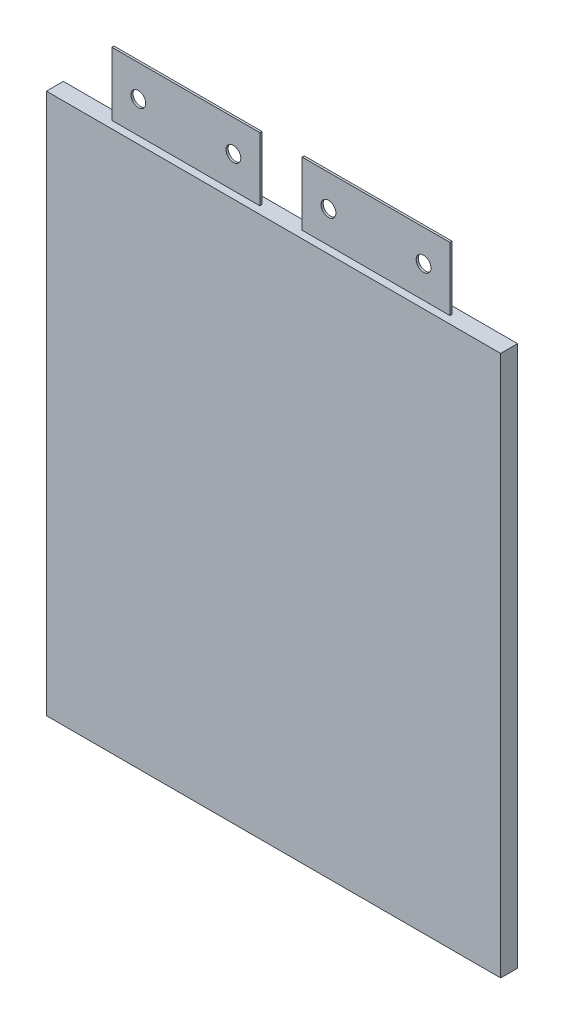
ISO-10303-21;
HEADER;
FILE_DESCRIPTION(('STEP AP214'),'2;1');
FILE_NAME('part.step','',(''),(''),'','','');
FILE_SCHEMA(('AUTOMOTIVE_DESIGN { 1 0 10303 214 1 1 1 1 }'));
ENDSEC;
DATA;
#1=APPLICATION_CONTEXT('core data for automotive mechanical design processes');
#2=APPLICATION_PROTOCOL_DEFINITION('international standard','automotive_design',2000,#1);
#3=PRODUCT_CONTEXT('',#1,'mechanical');
#4=PRODUCT('Part','Part','',(#3));
#5=PRODUCT_RELATED_PRODUCT_CATEGORY('part','',(#4));
#6=PRODUCT_DEFINITION_FORMATION('','',#4);
#7=PRODUCT_DEFINITION_CONTEXT('part definition',#1,'design');
#8=PRODUCT_DEFINITION('design','',#6,#7);
#9=PRODUCT_DEFINITION_SHAPE('','',#8);
#10=(LENGTH_UNIT() NAMED_UNIT(*) SI_UNIT(.MILLI.,.METRE.));
#11=(NAMED_UNIT(*) PLANE_ANGLE_UNIT() SI_UNIT($,.RADIAN.));
#12=(NAMED_UNIT(*) SI_UNIT($,.STERADIAN.) SOLID_ANGLE_UNIT());
#13=UNCERTAINTY_MEASURE_WITH_UNIT(LENGTH_MEASURE(1.E-05),#10,'distance_accuracy_value','');
#14=(GEOMETRIC_REPRESENTATION_CONTEXT(3) GLOBAL_UNCERTAINTY_ASSIGNED_CONTEXT((#13)) GLOBAL_UNIT_ASSIGNED_CONTEXT((#10,
#11,#12)) REPRESENTATION_CONTEXT('',''));
#15=CARTESIAN_POINT('',(0.,0.,0.));
#16=DIRECTION('',(0.,0.,1.));
#17=DIRECTION('',(1.,0.,0.));
#18=AXIS2_PLACEMENT_3D('',#15,#16,#17);
#19=CARTESIAN_POINT('',(0.,256.,8.));
#20=DIRECTION('',(0.,-1.,0.));
#21=DIRECTION('',(0.,0.,-1.));
#22=AXIS2_PLACEMENT_3D('',#19,#20,#21);
#23=PLANE('',#22);
#24=DIRECTION('',(-1.,0.,0.));
#25=VECTOR('',#24,1.);
#26=CARTESIAN_POINT('',(187.5,256.,3.49999999999998));
#27=LINE('',#26,#25);
#28=CARTESIAN_POINT('',(187.5,256.,3.49999999999998));
#29=VERTEX_POINT('',#28);
#30=CARTESIAN_POINT('',(117.5,256.,3.5));
#31=VERTEX_POINT('',#30);
#32=EDGE_CURVE('E127',#29,#31,#27,.T.);
#33=ORIENTED_EDGE('',*,*,#32,.F.);
#34=DIRECTION('',(0.,0.,1.));
#35=VECTOR('',#34,1.);
#36=CARTESIAN_POINT('',(187.5,256.,3.49999999999998));
#37=LINE('',#36,#35);
#38=CARTESIAN_POINT('',(187.5,256.,4.50000000000002));
#39=VERTEX_POINT('',#38);
#40=EDGE_CURVE('E136',#29,#39,#37,.T.);
#41=ORIENTED_EDGE('',*,*,#40,.T.);
#42=DIRECTION('',(-1.,0.,0.));
#43=VECTOR('',#42,1.);
#44=CARTESIAN_POINT('',(187.5,256.,4.50000000000002));
#45=LINE('',#44,#43);
#46=CARTESIAN_POINT('',(117.5,256.,4.5));
#47=VERTEX_POINT('',#46);
#48=EDGE_CURVE('E143',#39,#47,#45,.T.);
#49=ORIENTED_EDGE('',*,*,#48,.T.);
#50=DIRECTION('',(0.,0.,1.));
#51=VECTOR('',#50,1.);
#52=CARTESIAN_POINT('',(117.5,256.,3.5));
#53=LINE('',#52,#51);
#54=EDGE_CURVE('E47',#31,#47,#53,.T.);
#55=ORIENTED_EDGE('',*,*,#54,.F.);
#56=EDGE_LOOP('',(#33,#41,#49,#55));
#57=FACE_BOUND('',#56,.T.);
#58=DIRECTION('',(-1.,0.,0.));
#59=VECTOR('',#58,1.);
#60=CARTESIAN_POINT('',(0.,256.,0.));
#61=LINE('',#60,#59);
#62=CARTESIAN_POINT('',(215.,256.,0.));
#63=VERTEX_POINT('',#62);
#64=CARTESIAN_POINT('',(0.,256.,0.));
#65=VERTEX_POINT('',#64);
#66=EDGE_CURVE('E192',#63,#65,#61,.T.);
#67=ORIENTED_EDGE('',*,*,#66,.T.);
#68=DIRECTION('',(0.,0.,-1.));
#69=VECTOR('',#68,1.);
#70=CARTESIAN_POINT('',(0.,256.,8.));
#71=LINE('',#70,#69);
#72=CARTESIAN_POINT('',(0.,256.,8.));
#73=VERTEX_POINT('',#72);
#74=EDGE_CURVE('E198',#73,#65,#71,.T.);
#75=ORIENTED_EDGE('',*,*,#74,.F.);
#76=DIRECTION('',(-1.,0.,0.));
#77=VECTOR('',#76,1.);
#78=CARTESIAN_POINT('',(0.,256.,8.));
#79=LINE('',#78,#77);
#80=CARTESIAN_POINT('',(215.,256.,8.));
#81=VERTEX_POINT('',#80);
#82=EDGE_CURVE('E196',#81,#73,#79,.T.);
#83=ORIENTED_EDGE('',*,*,#82,.F.);
#84=DIRECTION('',(0.,0.,-1.));
#85=VECTOR('',#84,1.);
#86=CARTESIAN_POINT('',(215.,256.,8.));
#87=LINE('',#86,#85);
#88=EDGE_CURVE('E208',#81,#63,#87,.T.);
#89=ORIENTED_EDGE('',*,*,#88,.T.);
#90=EDGE_LOOP('',(#67,#75,#83,#89));
#91=FACE_BOUND('',#90,.T.);
#92=DIRECTION('',(0.,0.,1.));
#93=VECTOR('',#92,1.);
#94=CARTESIAN_POINT('',(27.5,256.,3.5));
#95=LINE('',#94,#93);
#96=CARTESIAN_POINT('',(27.5,256.,3.5));
#97=VERTEX_POINT('',#96);
#98=CARTESIAN_POINT('',(27.5,256.,4.5));
#99=VERTEX_POINT('',#98);
#100=EDGE_CURVE('E142',#97,#99,#95,.T.);
#101=ORIENTED_EDGE('',*,*,#100,.F.);
#102=DIRECTION('',(1.,0.,0.));
#103=VECTOR('',#102,1.);
#104=CARTESIAN_POINT('',(27.5,256.,3.5));
#105=LINE('',#104,#103);
#106=CARTESIAN_POINT('',(97.5,256.,3.5));
#107=VERTEX_POINT('',#106);
#108=EDGE_CURVE('E163',#97,#107,#105,.T.);
#109=ORIENTED_EDGE('',*,*,#108,.T.);
#110=DIRECTION('',(0.,0.,1.));
#111=VECTOR('',#110,1.);
#112=CARTESIAN_POINT('',(97.5,256.,3.5));
#113=LINE('',#112,#111);
#114=CARTESIAN_POINT('',(97.5,256.,4.5));
#115=VERTEX_POINT('',#114);
#116=EDGE_CURVE('E55',#107,#115,#113,.T.);
#117=ORIENTED_EDGE('',*,*,#116,.T.);
#118=DIRECTION('',(1.,0.,0.));
#119=VECTOR('',#118,1.);
#120=CARTESIAN_POINT('',(27.5,256.,4.5));
#121=LINE('',#120,#119);
#122=EDGE_CURVE('E174',#99,#115,#121,.T.);
#123=ORIENTED_EDGE('',*,*,#122,.F.);
#124=EDGE_LOOP('',(#101,#109,#117,#123));
#125=FACE_BOUND('',#124,.T.);
#126=ADVANCED_FACE('F32',(#57,#91,#125),#23,.F.);
#127=CARTESIAN_POINT('',(0.,0.,8.));
#128=DIRECTION('',(1.,0.,0.));
#129=DIRECTION('',(0.,0.,-1.));
#130=AXIS2_PLACEMENT_3D('',#127,#128,#129);
#131=PLANE('',#130);
#132=DIRECTION('',(0.,-1.,0.));
#133=VECTOR('',#132,1.);
#134=CARTESIAN_POINT('',(0.,0.,0.));
#135=LINE('',#134,#133);
#136=CARTESIAN_POINT('',(0.,0.,0.));
#137=VERTEX_POINT('',#136);
#138=EDGE_CURVE('E187',#65,#137,#135,.T.);
#139=ORIENTED_EDGE('',*,*,#138,.T.);
#140=DIRECTION('',(0.,0.,-1.));
#141=VECTOR('',#140,1.);
#142=CARTESIAN_POINT('',(0.,0.,8.));
#143=LINE('',#142,#141);
#144=CARTESIAN_POINT('',(0.,0.,8.));
#145=VERTEX_POINT('',#144);
#146=EDGE_CURVE('E11',#145,#137,#143,.T.);
#147=ORIENTED_EDGE('',*,*,#146,.F.);
#148=DIRECTION('',(0.,-1.,0.));
#149=VECTOR('',#148,1.);
#150=CARTESIAN_POINT('',(0.,0.,8.));
#151=LINE('',#150,#149);
#152=EDGE_CURVE('E188',#73,#145,#151,.T.);
#153=ORIENTED_EDGE('',*,*,#152,.F.);
#154=ORIENTED_EDGE('',*,*,#74,.T.);
#155=EDGE_LOOP('',(#139,#147,#153,#154));
#156=FACE_BOUND('',#155,.T.);
#157=ADVANCED_FACE('F34',(#156),#131,.F.);
#158=CARTESIAN_POINT('',(0.,0.,8.));
#159=DIRECTION('',(0.,1.,0.));
#160=DIRECTION('',(0.,0.,1.));
#161=AXIS2_PLACEMENT_3D('',#158,#159,#160);
#162=PLANE('',#161);
#163=DIRECTION('',(1.,0.,0.));
#164=VECTOR('',#163,1.);
#165=CARTESIAN_POINT('',(0.,0.,0.));
#166=LINE('',#165,#164);
#167=CARTESIAN_POINT('',(215.,0.,0.));
#168=VERTEX_POINT('',#167);
#169=EDGE_CURVE('E201',#137,#168,#166,.T.);
#170=ORIENTED_EDGE('',*,*,#169,.T.);
#171=DIRECTION('',(0.,0.,-1.));
#172=VECTOR('',#171,1.);
#173=CARTESIAN_POINT('',(215.,0.,8.));
#174=LINE('',#173,#172);
#175=CARTESIAN_POINT('',(215.,0.,8.));
#176=VERTEX_POINT('',#175);
#177=EDGE_CURVE('E40',#176,#168,#174,.T.);
#178=ORIENTED_EDGE('',*,*,#177,.F.);
#179=DIRECTION('',(1.,0.,0.));
#180=VECTOR('',#179,1.);
#181=CARTESIAN_POINT('',(0.,0.,8.));
#182=LINE('',#181,#180);
#183=EDGE_CURVE('E191',#145,#176,#182,.T.);
#184=ORIENTED_EDGE('',*,*,#183,.F.);
#185=ORIENTED_EDGE('',*,*,#146,.T.);
#186=EDGE_LOOP('',(#170,#178,#184,#185));
#187=FACE_BOUND('',#186,.T.);
#188=ADVANCED_FACE('F230',(#187),#162,.F.);
#189=CARTESIAN_POINT('',(215.,0.,8.));
#190=DIRECTION('',(-1.,0.,0.));
#191=DIRECTION('',(0.,0.,1.));
#192=AXIS2_PLACEMENT_3D('',#189,#190,#191);
#193=PLANE('',#192);
#194=DIRECTION('',(0.,1.,0.));
#195=VECTOR('',#194,1.);
#196=CARTESIAN_POINT('',(215.,0.,0.));
#197=LINE('',#196,#195);
#198=EDGE_CURVE('E203',#168,#63,#197,.T.);
#199=ORIENTED_EDGE('',*,*,#198,.T.);
#200=ORIENTED_EDGE('',*,*,#88,.F.);
#201=DIRECTION('',(0.,1.,0.));
#202=VECTOR('',#201,1.);
#203=CARTESIAN_POINT('',(215.,0.,8.));
#204=LINE('',#203,#202);
#205=EDGE_CURVE('E194',#176,#81,#204,.T.);
#206=ORIENTED_EDGE('',*,*,#205,.F.);
#207=ORIENTED_EDGE('',*,*,#177,.T.);
#208=EDGE_LOOP('',(#199,#200,#206,#207));
#209=FACE_BOUND('',#208,.T.);
#210=ADVANCED_FACE('F215',(#209),#193,.F.);
#211=CARTESIAN_POINT('',(0.,0.,8.));
#212=DIRECTION('',(0.,0.,-1.));
#213=DIRECTION('',(-1.,0.,0.));
#214=AXIS2_PLACEMENT_3D('',#211,#212,#213);
#215=PLANE('',#214);
#216=ORIENTED_EDGE('',*,*,#152,.T.);
#217=ORIENTED_EDGE('',*,*,#183,.T.);
#218=ORIENTED_EDGE('',*,*,#205,.T.);
#219=ORIENTED_EDGE('',*,*,#82,.T.);
#220=EDGE_LOOP('',(#216,#217,#218,#219));
#221=FACE_BOUND('',#220,.T.);
#222=ADVANCED_FACE('F229',(#221),#215,.F.);
#223=CARTESIAN_POINT('',(0.,0.,0.));
#224=DIRECTION('',(0.,0.,-1.));
#225=DIRECTION('',(-1.,0.,0.));
#226=AXIS2_PLACEMENT_3D('',#223,#224,#225);
#227=PLANE('',#226);
#228=ORIENTED_EDGE('',*,*,#138,.F.);
#229=ORIENTED_EDGE('',*,*,#66,.F.);
#230=ORIENTED_EDGE('',*,*,#198,.F.);
#231=ORIENTED_EDGE('',*,*,#169,.F.);
#232=EDGE_LOOP('',(#228,#229,#230,#231));
#233=FACE_BOUND('',#232,.T.);
#234=ADVANCED_FACE('F221',(#233),#227,.T.);
#235=CARTESIAN_POINT('',(27.5,286.,3.5));
#236=DIRECTION('',(1.,0.,0.));
#237=DIRECTION('',(0.,0.,-1.));
#238=AXIS2_PLACEMENT_3D('',#235,#236,#237);
#239=PLANE('',#238);
#240=ORIENTED_EDGE('',*,*,#100,.T.);
#241=DIRECTION('',(0.,-1.,0.));
#242=VECTOR('',#241,1.);
#243=CARTESIAN_POINT('',(27.5,286.,4.5));
#244=LINE('',#243,#242);
#245=CARTESIAN_POINT('',(27.5,286.,4.5));
#246=VERTEX_POINT('',#245);
#247=EDGE_CURVE('E185',#246,#99,#244,.T.);
#248=ORIENTED_EDGE('',*,*,#247,.F.);
#249=DIRECTION('',(0.,0.,1.));
#250=VECTOR('',#249,1.);
#251=CARTESIAN_POINT('',(27.5,286.,3.5));
#252=LINE('',#251,#250);
#253=CARTESIAN_POINT('',(27.5,286.,3.5));
#254=VERTEX_POINT('',#253);
#255=EDGE_CURVE('E159',#254,#246,#252,.T.);
#256=ORIENTED_EDGE('',*,*,#255,.F.);
#257=DIRECTION('',(0.,-1.,0.));
#258=VECTOR('',#257,1.);
#259=CARTESIAN_POINT('',(27.5,286.,3.5));
#260=LINE('',#259,#258);
#261=EDGE_CURVE('E171',#254,#97,#260,.T.);
#262=ORIENTED_EDGE('',*,*,#261,.T.);
#263=EDGE_LOOP('',(#240,#248,#256,#262));
#264=FACE_BOUND('',#263,.T.);
#265=ADVANCED_FACE('F244',(#264),#239,.F.);
#266=CARTESIAN_POINT('',(27.5,286.,4.5));
#267=DIRECTION('',(0.,0.,-1.));
#268=DIRECTION('',(-1.,0.,0.));
#269=AXIS2_PLACEMENT_3D('',#266,#267,#268);
#270=PLANE('',#269);
#271=CARTESIAN_POINT('',(40.,271.,4.5));
#272=DIRECTION('',(0.,0.,1.));
#273=DIRECTION('',(1.,0.,0.));
#274=AXIS2_PLACEMENT_3D('',#271,#272,#273);
#275=CIRCLE('',#274,3.5);
#276=CARTESIAN_POINT('',(43.5,271.,4.5));
#277=VERTEX_POINT('',#276);
#278=EDGE_CURVE('E133',#277,#277,#275,.T.);
#279=ORIENTED_EDGE('',*,*,#278,.F.);
#280=EDGE_LOOP('',(#279));
#281=FACE_BOUND('',#280,.T.);
#282=CARTESIAN_POINT('',(85.,271.,4.5));
#283=DIRECTION('',(0.,0.,1.));
#284=DIRECTION('',(1.,0.,0.));
#285=AXIS2_PLACEMENT_3D('',#282,#283,#284);
#286=CIRCLE('',#285,3.50000000000001);
#287=CARTESIAN_POINT('',(88.5,271.,4.5));
#288=VERTEX_POINT('',#287);
#289=EDGE_CURVE('E307',#288,#288,#286,.T.);
#290=ORIENTED_EDGE('',*,*,#289,.F.);
#291=EDGE_LOOP('',(#290));
#292=FACE_BOUND('',#291,.T.);
#293=ORIENTED_EDGE('',*,*,#122,.T.);
#294=DIRECTION('',(0.,-1.,0.));
#295=VECTOR('',#294,1.);
#296=CARTESIAN_POINT('',(97.5,286.,4.5));
#297=LINE('',#296,#295);
#298=CARTESIAN_POINT('',(97.5,286.,4.5));
#299=VERTEX_POINT('',#298);
#300=EDGE_CURVE('E183',#299,#115,#297,.T.);
#301=ORIENTED_EDGE('',*,*,#300,.F.);
#302=DIRECTION('',(1.,0.,0.));
#303=VECTOR('',#302,1.);
#304=CARTESIAN_POINT('',(27.5,286.,4.5));
#305=LINE('',#304,#303);
#306=EDGE_CURVE('E162',#246,#299,#305,.T.);
#307=ORIENTED_EDGE('',*,*,#306,.F.);
#308=ORIENTED_EDGE('',*,*,#247,.T.);
#309=EDGE_LOOP('',(#293,#301,#307,#308));
#310=FACE_BOUND('',#309,.T.);
#311=ADVANCED_FACE('F249',(#281,#292,#310),#270,.F.);
#312=CARTESIAN_POINT('',(97.5,286.,3.5));
#313=DIRECTION('',(1.,0.,0.));
#314=DIRECTION('',(0.,0.,-1.));
#315=AXIS2_PLACEMENT_3D('',#312,#313,#314);
#316=PLANE('',#315);
#317=ORIENTED_EDGE('',*,*,#116,.F.);
#318=DIRECTION('',(0.,-1.,0.));
#319=VECTOR('',#318,1.);
#320=CARTESIAN_POINT('',(97.5,286.,3.5));
#321=LINE('',#320,#319);
#322=CARTESIAN_POINT('',(97.5,286.,3.5));
#323=VERTEX_POINT('',#322);
#324=EDGE_CURVE('E181',#323,#107,#321,.T.);
#325=ORIENTED_EDGE('',*,*,#324,.F.);
#326=DIRECTION('',(0.,0.,1.));
#327=VECTOR('',#326,1.);
#328=CARTESIAN_POINT('',(97.5,286.,3.5));
#329=LINE('',#328,#327);
#330=EDGE_CURVE('E165',#323,#299,#329,.T.);
#331=ORIENTED_EDGE('',*,*,#330,.T.);
#332=ORIENTED_EDGE('',*,*,#300,.T.);
#333=EDGE_LOOP('',(#317,#325,#331,#332));
#334=FACE_BOUND('',#333,.T.);
#335=ADVANCED_FACE('F253',(#334),#316,.T.);
#336=CARTESIAN_POINT('',(27.5,286.,3.5));
#337=DIRECTION('',(0.,0.,-1.));
#338=DIRECTION('',(-1.,0.,0.));
#339=AXIS2_PLACEMENT_3D('',#336,#337,#338);
#340=PLANE('',#339);
#341=CARTESIAN_POINT('',(40.,271.,3.5));
#342=DIRECTION('',(0.,0.,-1.));
#343=DIRECTION('',(-1.,0.,0.));
#344=AXIS2_PLACEMENT_3D('',#341,#342,#343);
#345=CIRCLE('',#344,3.5);
#346=CARTESIAN_POINT('',(36.5,271.,3.5));
#347=VERTEX_POINT('',#346);
#348=EDGE_CURVE('E317',#347,#347,#345,.F.);
#349=ORIENTED_EDGE('',*,*,#348,.T.);
#350=EDGE_LOOP('',(#349));
#351=FACE_BOUND('',#350,.T.);
#352=CARTESIAN_POINT('',(85.,271.,3.5));
#353=DIRECTION('',(0.,0.,-1.));
#354=DIRECTION('',(-1.,0.,0.));
#355=AXIS2_PLACEMENT_3D('',#352,#353,#354);
#356=CIRCLE('',#355,3.50000000000001);
#357=CARTESIAN_POINT('',(81.5,271.,3.5));
#358=VERTEX_POINT('',#357);
#359=EDGE_CURVE('E320',#358,#358,#356,.F.);
#360=ORIENTED_EDGE('',*,*,#359,.T.);
#361=EDGE_LOOP('',(#360));
#362=FACE_BOUND('',#361,.T.);
#363=ORIENTED_EDGE('',*,*,#108,.F.);
#364=ORIENTED_EDGE('',*,*,#261,.F.);
#365=DIRECTION('',(1.,0.,0.));
#366=VECTOR('',#365,1.);
#367=CARTESIAN_POINT('',(27.5,286.,3.5));
#368=LINE('',#367,#366);
#369=EDGE_CURVE('E168',#254,#323,#368,.T.);
#370=ORIENTED_EDGE('',*,*,#369,.T.);
#371=ORIENTED_EDGE('',*,*,#324,.T.);
#372=EDGE_LOOP('',(#363,#364,#370,#371));
#373=FACE_BOUND('',#372,.T.);
#374=ADVANCED_FACE('F257',(#351,#362,#373),#340,.T.);
#375=CARTESIAN_POINT('',(0.,286.,0.));
#376=DIRECTION('',(0.,1.,0.));
#377=DIRECTION('',(0.,0.,1.));
#378=AXIS2_PLACEMENT_3D('',#375,#376,#377);
#379=PLANE('',#378);
#380=ORIENTED_EDGE('',*,*,#255,.T.);
#381=ORIENTED_EDGE('',*,*,#306,.T.);
#382=ORIENTED_EDGE('',*,*,#330,.F.);
#383=ORIENTED_EDGE('',*,*,#369,.F.);
#384=EDGE_LOOP('',(#380,#381,#382,#383));
#385=FACE_BOUND('',#384,.T.);
#386=ADVANCED_FACE('F260',(#385),#379,.T.);
#387=CARTESIAN_POINT('',(187.5,286.,3.49999999999998));
#388=DIRECTION('',(1.,0.,0.));
#389=DIRECTION('',(0.,0.,-1.));
#390=AXIS2_PLACEMENT_3D('',#387,#388,#389);
#391=PLANE('',#390);
#392=ORIENTED_EDGE('',*,*,#40,.F.);
#393=DIRECTION('',(0.,-1.,0.));
#394=VECTOR('',#393,1.);
#395=CARTESIAN_POINT('',(187.5,286.,3.49999999999998));
#396=LINE('',#395,#394);
#397=CARTESIAN_POINT('',(187.5,286.,3.49999999999998));
#398=VERTEX_POINT('',#397);
#399=EDGE_CURVE('E122',#398,#29,#396,.T.);
#400=ORIENTED_EDGE('',*,*,#399,.F.);
#401=DIRECTION('',(0.,0.,1.));
#402=VECTOR('',#401,1.);
#403=CARTESIAN_POINT('',(187.5,286.,3.49999999999998));
#404=LINE('',#403,#402);
#405=CARTESIAN_POINT('',(187.5,286.,4.50000000000002));
#406=VERTEX_POINT('',#405);
#407=EDGE_CURVE('E146',#398,#406,#404,.T.);
#408=ORIENTED_EDGE('',*,*,#407,.T.);
#409=DIRECTION('',(0.,-1.,0.));
#410=VECTOR('',#409,1.);
#411=CARTESIAN_POINT('',(187.5,286.,4.50000000000002));
#412=LINE('',#411,#410);
#413=EDGE_CURVE('E138',#406,#39,#412,.T.);
#414=ORIENTED_EDGE('',*,*,#413,.T.);
#415=EDGE_LOOP('',(#392,#400,#408,#414));
#416=FACE_BOUND('',#415,.T.);
#417=ADVANCED_FACE('F137',(#416),#391,.T.);
#418=CARTESIAN_POINT('',(187.5,286.,3.49999999999998));
#419=DIRECTION('',(0.,0.,1.));
#420=DIRECTION('',(1.,0.,0.));
#421=AXIS2_PLACEMENT_3D('',#418,#419,#420);
#422=PLANE('',#421);
#423=CARTESIAN_POINT('',(175.,271.,3.49999999999998));
#424=DIRECTION('',(0.,0.,1.));
#425=DIRECTION('',(1.,0.,0.));
#426=AXIS2_PLACEMENT_3D('',#423,#424,#425);
#427=CIRCLE('',#426,3.5);
#428=CARTESIAN_POINT('',(178.5,271.,3.49999999999998));
#429=VERTEX_POINT('',#428);
#430=EDGE_CURVE('E304',#429,#429,#427,.T.);
#431=ORIENTED_EDGE('',*,*,#430,.T.);
#432=EDGE_LOOP('',(#431));
#433=FACE_BOUND('',#432,.T.);
#434=CARTESIAN_POINT('',(130.,271.,3.49999999999999));
#435=DIRECTION('',(0.,0.,1.));
#436=DIRECTION('',(1.,0.,0.));
#437=AXIS2_PLACEMENT_3D('',#434,#435,#436);
#438=CIRCLE('',#437,3.50000000000001);
#439=CARTESIAN_POINT('',(133.5,271.,3.49999999999999));
#440=VERTEX_POINT('',#439);
#441=EDGE_CURVE('E310',#440,#440,#438,.T.);
#442=ORIENTED_EDGE('',*,*,#441,.T.);
#443=EDGE_LOOP('',(#442));
#444=FACE_BOUND('',#443,.T.);
#445=ORIENTED_EDGE('',*,*,#32,.T.);
#446=DIRECTION('',(0.,-1.,0.));
#447=VECTOR('',#446,1.);
#448=CARTESIAN_POINT('',(117.5,286.,3.5));
#449=LINE('',#448,#447);
#450=CARTESIAN_POINT('',(117.5,286.,3.5));
#451=VERTEX_POINT('',#450);
#452=EDGE_CURVE('E132',#451,#31,#449,.T.);
#453=ORIENTED_EDGE('',*,*,#452,.F.);
#454=DIRECTION('',(-1.,0.,0.));
#455=VECTOR('',#454,1.);
#456=CARTESIAN_POINT('',(187.5,286.,3.49999999999998));
#457=LINE('',#456,#455);
#458=EDGE_CURVE('E128',#398,#451,#457,.T.);
#459=ORIENTED_EDGE('',*,*,#458,.F.);
#460=ORIENTED_EDGE('',*,*,#399,.T.);
#461=EDGE_LOOP('',(#445,#453,#459,#460));
#462=FACE_BOUND('',#461,.T.);
#463=ADVANCED_FACE('F124',(#433,#444,#462),#422,.F.);
#464=CARTESIAN_POINT('',(117.5,286.,3.5));
#465=DIRECTION('',(1.,0.,0.));
#466=DIRECTION('',(0.,0.,-1.));
#467=AXIS2_PLACEMENT_3D('',#464,#465,#466);
#468=PLANE('',#467);
#469=ORIENTED_EDGE('',*,*,#54,.T.);
#470=DIRECTION('',(0.,-1.,0.));
#471=VECTOR('',#470,1.);
#472=CARTESIAN_POINT('',(117.5,286.,4.5));
#473=LINE('',#472,#471);
#474=CARTESIAN_POINT('',(117.5,286.,4.5));
#475=VERTEX_POINT('',#474);
#476=EDGE_CURVE('E326',#475,#47,#473,.T.);
#477=ORIENTED_EDGE('',*,*,#476,.F.);
#478=DIRECTION('',(0.,0.,1.));
#479=VECTOR('',#478,1.);
#480=CARTESIAN_POINT('',(117.5,286.,3.5));
#481=LINE('',#480,#479);
#482=EDGE_CURVE('E155',#451,#475,#481,.T.);
#483=ORIENTED_EDGE('',*,*,#482,.F.);
#484=ORIENTED_EDGE('',*,*,#452,.T.);
#485=EDGE_LOOP('',(#469,#477,#483,#484));
#486=FACE_BOUND('',#485,.T.);
#487=ADVANCED_FACE('F273',(#486),#468,.F.);
#488=CARTESIAN_POINT('',(187.5,286.,4.50000000000002));
#489=DIRECTION('',(0.,0.,1.));
#490=DIRECTION('',(1.,0.,0.));
#491=AXIS2_PLACEMENT_3D('',#488,#489,#490);
#492=PLANE('',#491);
#493=CARTESIAN_POINT('',(175.,271.,4.5));
#494=DIRECTION('',(0.,0.,-1.));
#495=DIRECTION('',(-1.,0.,0.));
#496=AXIS2_PLACEMENT_3D('',#493,#494,#495);
#497=CIRCLE('',#496,3.5);
#498=CARTESIAN_POINT('',(171.5,271.,4.5));
#499=VERTEX_POINT('',#498);
#500=EDGE_CURVE('E301',#499,#499,#497,.T.);
#501=ORIENTED_EDGE('',*,*,#500,.T.);
#502=EDGE_LOOP('',(#501));
#503=FACE_BOUND('',#502,.T.);
#504=CARTESIAN_POINT('',(130.,271.,4.5));
#505=DIRECTION('',(0.,0.,-1.));
#506=DIRECTION('',(-1.,0.,0.));
#507=AXIS2_PLACEMENT_3D('',#504,#505,#506);
#508=CIRCLE('',#507,3.50000000000001);
#509=CARTESIAN_POINT('',(126.5,271.,4.5));
#510=VERTEX_POINT('',#509);
#511=EDGE_CURVE('E305',#510,#510,#508,.T.);
#512=ORIENTED_EDGE('',*,*,#511,.T.);
#513=EDGE_LOOP('',(#512));
#514=FACE_BOUND('',#513,.T.);
#515=ORIENTED_EDGE('',*,*,#48,.F.);
#516=ORIENTED_EDGE('',*,*,#413,.F.);
#517=DIRECTION('',(-1.,0.,0.));
#518=VECTOR('',#517,1.);
#519=CARTESIAN_POINT('',(187.5,286.,4.50000000000002));
#520=LINE('',#519,#518);
#521=EDGE_CURVE('E149',#406,#475,#520,.T.);
#522=ORIENTED_EDGE('',*,*,#521,.T.);
#523=ORIENTED_EDGE('',*,*,#476,.T.);
#524=EDGE_LOOP('',(#515,#516,#522,#523));
#525=FACE_BOUND('',#524,.T.);
#526=ADVANCED_FACE('F269',(#503,#514,#525),#492,.T.);
#527=CARTESIAN_POINT('',(0.,286.,0.));
#528=DIRECTION('',(0.,-1.,0.));
#529=DIRECTION('',(0.,0.,-1.));
#530=AXIS2_PLACEMENT_3D('',#527,#528,#529);
#531=PLANE('',#530);
#532=ORIENTED_EDGE('',*,*,#407,.F.);
#533=ORIENTED_EDGE('',*,*,#458,.T.);
#534=ORIENTED_EDGE('',*,*,#482,.T.);
#535=ORIENTED_EDGE('',*,*,#521,.F.);
#536=EDGE_LOOP('',(#532,#533,#534,#535));
#537=FACE_BOUND('',#536,.T.);
#538=ADVANCED_FACE('F265',(#537),#531,.F.);
#539=CARTESIAN_POINT('',(85.,271.,-0.00100000000000013));
#540=DIRECTION('',(0.,0.,1.));
#541=DIRECTION('',(1.,0.,0.));
#542=AXIS2_PLACEMENT_3D('',#539,#540,#541);
#543=CYLINDRICAL_SURFACE('',#542,3.50000000000001);
#544=ORIENTED_EDGE('',*,*,#359,.F.);
#545=EDGE_LOOP('',(#544));
#546=FACE_BOUND('',#545,.T.);
#547=ORIENTED_EDGE('',*,*,#289,.T.);
#548=EDGE_LOOP('',(#547));
#549=FACE_BOUND('',#548,.T.);
#550=ADVANCED_FACE('F268',(#546,#549),#543,.F.);
#551=CARTESIAN_POINT('',(40.,271.,-0.00100000000000013));
#552=DIRECTION('',(0.,0.,1.));
#553=DIRECTION('',(1.,0.,0.));
#554=AXIS2_PLACEMENT_3D('',#551,#552,#553);
#555=CYLINDRICAL_SURFACE('',#554,3.5);
#556=ORIENTED_EDGE('',*,*,#348,.F.);
#557=EDGE_LOOP('',(#556));
#558=FACE_BOUND('',#557,.T.);
#559=ORIENTED_EDGE('',*,*,#278,.T.);
#560=EDGE_LOOP('',(#559));
#561=FACE_BOUND('',#560,.T.);
#562=ADVANCED_FACE('F284',(#558,#561),#555,.F.);
#563=CARTESIAN_POINT('',(130.,271.,-0.00100000000000013));
#564=DIRECTION('',(0.,0.,1.));
#565=DIRECTION('',(1.,0.,0.));
#566=AXIS2_PLACEMENT_3D('',#563,#564,#565);
#567=CYLINDRICAL_SURFACE('',#566,3.50000000000001);
#568=ORIENTED_EDGE('',*,*,#511,.F.);
#569=EDGE_LOOP('',(#568));
#570=FACE_BOUND('',#569,.T.);
#571=ORIENTED_EDGE('',*,*,#441,.F.);
#572=EDGE_LOOP('',(#571));
#573=FACE_BOUND('',#572,.T.);
#574=ADVANCED_FACE('F288',(#570,#573),#567,.F.);
#575=CARTESIAN_POINT('',(175.,271.,-0.00100000000000013));
#576=DIRECTION('',(0.,0.,1.));
#577=DIRECTION('',(1.,0.,0.));
#578=AXIS2_PLACEMENT_3D('',#575,#576,#577);
#579=CYLINDRICAL_SURFACE('',#578,3.5);
#580=ORIENTED_EDGE('',*,*,#500,.F.);
#581=EDGE_LOOP('',(#580));
#582=FACE_BOUND('',#581,.T.);
#583=ORIENTED_EDGE('',*,*,#430,.F.);
#584=EDGE_LOOP('',(#583));
#585=FACE_BOUND('',#584,.T.);
#586=ADVANCED_FACE('F292',(#582,#585),#579,.F.);
#587=CLOSED_SHELL('',(#126,#157,#188,#210,#222,#234,#265,#311,#335,#374,#386,#417,#463,#487,
#526,#538,#550,#562,#574,#586));
#588=MANIFOLD_SOLID_BREP('B2',#587);
#589=ADVANCED_BREP_SHAPE_REPRESENTATION('',(#18,#588),#14);
#590=SHAPE_DEFINITION_REPRESENTATION(#9,#589);
ENDSEC;
END-ISO-10303-21;
